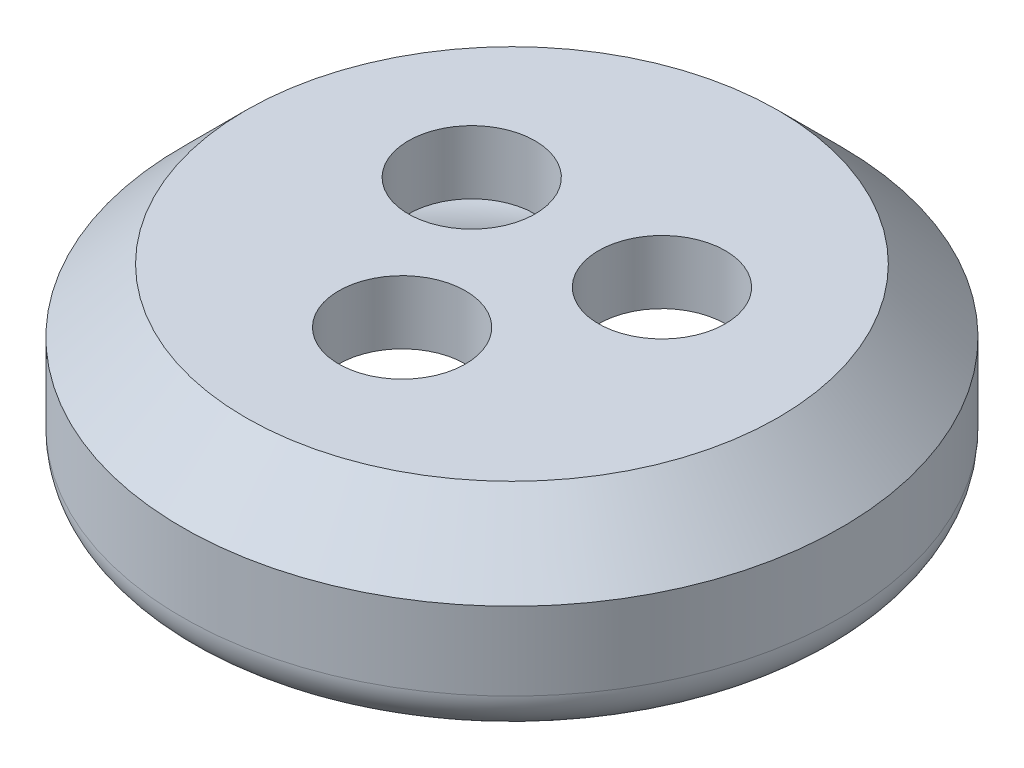
ISO-10303-21;
HEADER;
FILE_DESCRIPTION(('STEP AP214'),'2;1');
FILE_NAME('part.step','',(''),(''),'','','');
FILE_SCHEMA(('AUTOMOTIVE_DESIGN { 1 0 10303 214 1 1 1 1 }'));
ENDSEC;
DATA;
#1=APPLICATION_CONTEXT('core data for automotive mechanical design processes');
#2=APPLICATION_PROTOCOL_DEFINITION('international standard','automotive_design',2000,#1);
#3=PRODUCT_CONTEXT('',#1,'mechanical');
#4=PRODUCT('Part','Part','',(#3));
#5=PRODUCT_RELATED_PRODUCT_CATEGORY('part','',(#4));
#6=PRODUCT_DEFINITION_FORMATION('','',#4);
#7=PRODUCT_DEFINITION_CONTEXT('part definition',#1,'design');
#8=PRODUCT_DEFINITION('design','',#6,#7);
#9=PRODUCT_DEFINITION_SHAPE('','',#8);
#10=(LENGTH_UNIT() NAMED_UNIT(*) SI_UNIT(.MILLI.,.METRE.));
#11=(NAMED_UNIT(*) PLANE_ANGLE_UNIT() SI_UNIT($,.RADIAN.));
#12=(NAMED_UNIT(*) SI_UNIT($,.STERADIAN.) SOLID_ANGLE_UNIT());
#13=UNCERTAINTY_MEASURE_WITH_UNIT(LENGTH_MEASURE(1.E-05),#10,'distance_accuracy_value','');
#14=(GEOMETRIC_REPRESENTATION_CONTEXT(3) GLOBAL_UNCERTAINTY_ASSIGNED_CONTEXT((#13)) GLOBAL_UNIT_ASSIGNED_CONTEXT((#10,
#11,#12)) REPRESENTATION_CONTEXT('',''));
#15=CARTESIAN_POINT('',(0.,0.,0.));
#16=DIRECTION('',(0.,0.,1.));
#17=DIRECTION('',(1.,0.,0.));
#18=AXIS2_PLACEMENT_3D('',#15,#16,#17);
#19=CARTESIAN_POINT('',(0.,22.1772541756381,0.));
#20=DIRECTION('',(0.,-1.,0.));
#21=DIRECTION('',(0.,0.,-1.));
#22=AXIS2_PLACEMENT_3D('',#19,#20,#21);
#23=PLANE('',#22);
#24=CARTESIAN_POINT('',(0.,22.1772541756381,5.19615242270663));
#25=DIRECTION('',(0.,-1.,0.));
#26=DIRECTION('',(0.,0.,-1.));
#27=AXIS2_PLACEMENT_3D('',#24,#25,#26);
#28=CIRCLE('',#27,3.);
#29=CARTESIAN_POINT('',(0.,22.1772541756381,2.19615242270663));
#30=VERTEX_POINT('',#29);
#31=EDGE_CURVE('E103',#30,#30,#28,.F.);
#32=ORIENTED_EDGE('',*,*,#31,.F.);
#33=EDGE_LOOP('',(#32));
#34=FACE_BOUND('',#33,.T.);
#35=CARTESIAN_POINT('',(4.5,22.1772541756381,-2.59807621135331));
#36=DIRECTION('',(0.,-1.,0.));
#37=DIRECTION('',(0.,0.,-1.));
#38=AXIS2_PLACEMENT_3D('',#35,#36,#37);
#39=CIRCLE('',#38,3.);
#40=CARTESIAN_POINT('',(4.5,22.1772541756381,-5.59807621135332));
#41=VERTEX_POINT('',#40);
#42=EDGE_CURVE('E102',#41,#41,#39,.F.);
#43=ORIENTED_EDGE('',*,*,#42,.F.);
#44=EDGE_LOOP('',(#43));
#45=FACE_BOUND('',#44,.T.);
#46=CARTESIAN_POINT('',(-4.5,22.1772541756381,-2.59807621135332));
#47=DIRECTION('',(0.,-1.,0.));
#48=DIRECTION('',(0.,0.,-1.));
#49=AXIS2_PLACEMENT_3D('',#46,#47,#48);
#50=CIRCLE('',#49,3.);
#51=CARTESIAN_POINT('',(-4.5,22.1772541756381,-5.59807621135332));
#52=VERTEX_POINT('',#51);
#53=EDGE_CURVE('E94',#52,#52,#50,.F.);
#54=ORIENTED_EDGE('',*,*,#53,.F.);
#55=EDGE_LOOP('',(#54));
#56=FACE_BOUND('',#55,.T.);
#57=CARTESIAN_POINT('',(0.,22.1772541756381,0.));
#58=DIRECTION('',(0.,-1.,0.));
#59=DIRECTION('',(0.,0.,-1.));
#60=AXIS2_PLACEMENT_3D('',#57,#58,#59);
#61=CIRCLE('',#60,12.5931141475019);
#62=CARTESIAN_POINT('',(0.,22.1772541756381,-12.5931141475019));
#63=VERTEX_POINT('',#62);
#64=EDGE_CURVE('E10',#63,#63,#61,.T.);
#65=ORIENTED_EDGE('',*,*,#64,.F.);
#66=EDGE_LOOP('',(#65));
#67=FACE_BOUND('',#66,.T.);
#68=ADVANCED_FACE('F39',(#34,#45,#56,#67),#23,.F.);
#69=CARTESIAN_POINT('',(0.,22.1772541756381,0.));
#70=DIRECTION('',(0.,-1.,0.));
#71=DIRECTION('',(0.,0.,-1.));
#72=AXIS2_PLACEMENT_3D('',#69,#70,#71);
#73=CONICAL_SURFACE('',#72,12.5931141475019,0.785398163397448);
#74=CARTESIAN_POINT('',(0.,19.1772541756381,0.));
#75=DIRECTION('',(0.,-1.,0.));
#76=DIRECTION('',(0.,0.,-1.));
#77=AXIS2_PLACEMENT_3D('',#74,#75,#76);
#78=CIRCLE('',#77,15.5931141475019);
#79=CARTESIAN_POINT('',(0.,19.1772541756381,-15.5931141475019));
#80=VERTEX_POINT('',#79);
#81=EDGE_CURVE('E46',#80,#80,#78,.T.);
#82=ORIENTED_EDGE('',*,*,#81,.F.);
#83=EDGE_LOOP('',(#82));
#84=FACE_BOUND('',#83,.T.);
#85=ORIENTED_EDGE('',*,*,#64,.T.);
#86=EDGE_LOOP('',(#85));
#87=FACE_BOUND('',#86,.T.);
#88=ADVANCED_FACE('F188',(#84,#87),#73,.T.);
#89=CARTESIAN_POINT('',(0.,0.,0.));
#90=DIRECTION('',(0.,-1.,0.));
#91=DIRECTION('',(0.,0.,-1.));
#92=AXIS2_PLACEMENT_3D('',#89,#90,#91);
#93=CYLINDRICAL_SURFACE('',#92,15.5931141475019);
#94=CARTESIAN_POINT('',(0.,15.4951117662924,0.));
#95=DIRECTION('',(0.,-1.,0.));
#96=DIRECTION('',(0.,0.,-1.));
#97=AXIS2_PLACEMENT_3D('',#94,#95,#96);
#98=CIRCLE('',#97,15.5931141475019);
#99=CARTESIAN_POINT('',(0.,15.4951117662924,-15.5931141475019));
#100=VERTEX_POINT('',#99);
#101=EDGE_CURVE('E51',#100,#100,#98,.T.);
#102=ORIENTED_EDGE('',*,*,#101,.F.);
#103=EDGE_LOOP('',(#102));
#104=FACE_BOUND('',#103,.T.);
#105=ORIENTED_EDGE('',*,*,#81,.T.);
#106=EDGE_LOOP('',(#105));
#107=FACE_BOUND('',#106,.T.);
#108=ADVANCED_FACE('F183',(#104,#107),#93,.T.);
#109=CARTESIAN_POINT('',(0.,15.4951117662924,0.));
#110=DIRECTION('',(0.,-1.,0.));
#111=DIRECTION('',(0.,0.,-1.));
#112=AXIS2_PLACEMENT_3D('',#109,#110,#111);
#113=TOROIDAL_SURFACE('',#112,13.5931141475019,2.);
#114=CARTESIAN_POINT('',(0.,13.4951117662924,0.));
#115=DIRECTION('',(0.,-1.,0.));
#116=DIRECTION('',(0.,0.,-1.));
#117=AXIS2_PLACEMENT_3D('',#114,#115,#116);
#118=CIRCLE('',#117,13.5931141475018);
#119=CARTESIAN_POINT('',(0.,13.4951117662924,-13.5931141475018));
#120=VERTEX_POINT('',#119);
#121=EDGE_CURVE('E56',#120,#120,#118,.T.);
#122=ORIENTED_EDGE('',*,*,#121,.F.);
#123=EDGE_LOOP('',(#122));
#124=FACE_BOUND('',#123,.T.);
#125=ORIENTED_EDGE('',*,*,#101,.T.);
#126=EDGE_LOOP('',(#125));
#127=FACE_BOUND('',#126,.T.);
#128=ADVANCED_FACE('F177',(#124,#127),#113,.T.);
#129=CARTESIAN_POINT('',(-12.5653280214104,13.4951117662924,0.));
#130=DIRECTION('',(0.,1.,0.));
#131=DIRECTION('',(0.,0.,1.));
#132=AXIS2_PLACEMENT_3D('',#129,#130,#131);
#133=PLANE('',#132);
#134=CARTESIAN_POINT('',(0.,13.4951117662924,0.));
#135=DIRECTION('',(0.,-1.,0.));
#136=DIRECTION('',(0.,0.,-1.));
#137=AXIS2_PLACEMENT_3D('',#134,#135,#136);
#138=CIRCLE('',#137,12.5653280214104);
#139=CARTESIAN_POINT('',(0.,13.4951117662924,-12.5653280214104));
#140=VERTEX_POINT('',#139);
#141=EDGE_CURVE('E62',#140,#140,#138,.T.);
#142=ORIENTED_EDGE('',*,*,#141,.F.);
#143=EDGE_LOOP('',(#142));
#144=FACE_BOUND('',#143,.T.);
#145=ORIENTED_EDGE('',*,*,#121,.T.);
#146=EDGE_LOOP('',(#145));
#147=FACE_BOUND('',#146,.T.);
#148=ADVANCED_FACE('F171',(#144,#147),#133,.F.);
#149=CARTESIAN_POINT('',(0.,14.0272541756381,0.));
#150=DIRECTION('',(0.,-1.,0.));
#151=DIRECTION('',(0.,0.,-1.));
#152=AXIS2_PLACEMENT_3D('',#149,#150,#151);
#153=TOROIDAL_SURFACE('',#152,14.7,2.19999999999999);
#154=CARTESIAN_POINT('',(0.,15.8147541756381,0.));
#155=DIRECTION('',(0.,-1.,0.));
#156=DIRECTION('',(0.,0.,-1.));
#157=AXIS2_PLACEMENT_3D('',#154,#155,#156);
#158=CIRCLE('',#157,13.4174853802003);
#159=CARTESIAN_POINT('',(0.,15.8147541756381,-13.4174853802003));
#160=VERTEX_POINT('',#159);
#161=EDGE_CURVE('E66',#160,#160,#158,.T.);
#162=ORIENTED_EDGE('',*,*,#161,.F.);
#163=EDGE_LOOP('',(#162));
#164=FACE_BOUND('',#163,.T.);
#165=ORIENTED_EDGE('',*,*,#141,.T.);
#166=EDGE_LOOP('',(#165));
#167=FACE_BOUND('',#166,.T.);
#168=ADVANCED_FACE('F165',(#164,#167),#153,.T.);
#169=CARTESIAN_POINT('',(0.,16.3835041756381,0.));
#170=DIRECTION('',(0.,-1.,0.));
#171=DIRECTION('',(0.,0.,-1.));
#172=AXIS2_PLACEMENT_3D('',#169,#170,#171);
#173=TOROIDAL_SURFACE('',#172,13.0094125466276,0.700000000000009);
#174=CARTESIAN_POINT('',(0.,15.9971203753347,0.));
#175=DIRECTION('',(0.,-1.,0.));
#176=DIRECTION('',(0.,0.,-1.));
#177=AXIS2_PLACEMENT_3D('',#174,#175,#176);
#178=CIRCLE('',#177,13.5931141475019);
#179=CARTESIAN_POINT('',(0.,15.9971203753347,-13.5931141475019));
#180=VERTEX_POINT('',#179);
#181=EDGE_CURVE('E70',#180,#180,#178,.T.);
#182=ORIENTED_EDGE('',*,*,#181,.F.);
#183=EDGE_LOOP('',(#182));
#184=FACE_BOUND('',#183,.T.);
#185=ORIENTED_EDGE('',*,*,#161,.T.);
#186=EDGE_LOOP('',(#185));
#187=FACE_BOUND('',#186,.T.);
#188=ADVANCED_FACE('F159',(#184,#187),#173,.F.);
#189=CARTESIAN_POINT('',(0.,16.4772541756381,0.));
#190=DIRECTION('',(0.,-1.,0.));
#191=DIRECTION('',(0.,0.,-1.));
#192=AXIS2_PLACEMENT_3D('',#189,#190,#191);
#193=TOROIDAL_SURFACE('',#192,9.42064826581916,4.19999999999999);
#194=CARTESIAN_POINT('',(0.,18.8063097842711,0.));
#195=DIRECTION('',(0.,-1.,0.));
#196=DIRECTION('',(0.,0.,-1.));
#197=AXIS2_PLACEMENT_3D('',#194,#195,#196);
#198=CIRCLE('',#197,12.9157162153582);
#199=CARTESIAN_POINT('',(0.,18.8063097842711,-12.9157162153582));
#200=VERTEX_POINT('',#199);
#201=EDGE_CURVE('E74',#200,#200,#198,.T.);
#202=ORIENTED_EDGE('',*,*,#201,.F.);
#203=EDGE_LOOP('',(#202));
#204=FACE_BOUND('',#203,.T.);
#205=ORIENTED_EDGE('',*,*,#181,.T.);
#206=EDGE_LOOP('',(#205));
#207=FACE_BOUND('',#206,.T.);
#208=ADVANCED_FACE('F153',(#204,#207),#193,.F.);
#209=CARTESIAN_POINT('',(0.,17.5772541756381,0.));
#210=DIRECTION('',(0.,-1.,0.));
#211=DIRECTION('',(0.,0.,-1.));
#212=AXIS2_PLACEMENT_3D('',#209,#210,#211);
#213=TOROIDAL_SURFACE('',#212,10.6245544334476,2.6);
#214=CARTESIAN_POINT('',(0.,20.1772541756381,0.));
#215=DIRECTION('',(0.,-1.,0.));
#216=DIRECTION('',(0.,0.,-1.));
#217=AXIS2_PLACEMENT_3D('',#214,#215,#216);
#218=CIRCLE('',#217,10.6245544334476);
#219=CARTESIAN_POINT('',(0.,20.1772541756381,-10.6245544334476));
#220=VERTEX_POINT('',#219);
#221=EDGE_CURVE('E78',#220,#220,#218,.T.);
#222=ORIENTED_EDGE('',*,*,#221,.F.);
#223=EDGE_LOOP('',(#222));
#224=FACE_BOUND('',#223,.T.);
#225=ORIENTED_EDGE('',*,*,#201,.T.);
#226=EDGE_LOOP('',(#225));
#227=FACE_BOUND('',#226,.T.);
#228=ADVANCED_FACE('F147',(#224,#227),#213,.F.);
#229=CARTESIAN_POINT('',(-9.74999999999999,20.1772541756381,0.));
#230=DIRECTION('',(0.,1.,0.));
#231=DIRECTION('',(0.,0.,1.));
#232=AXIS2_PLACEMENT_3D('',#229,#230,#231);
#233=PLANE('',#232);
#234=CARTESIAN_POINT('',(0.,20.1772541756381,0.));
#235=DIRECTION('',(0.,-1.,0.));
#236=DIRECTION('',(0.,0.,-1.));
#237=AXIS2_PLACEMENT_3D('',#234,#235,#236);
#238=CIRCLE('',#237,9.74999999999999);
#239=CARTESIAN_POINT('',(0.,20.1772541756381,-9.74999999999999));
#240=VERTEX_POINT('',#239);
#241=EDGE_CURVE('E82',#240,#240,#238,.T.);
#242=ORIENTED_EDGE('',*,*,#241,.F.);
#243=EDGE_LOOP('',(#242));
#244=FACE_BOUND('',#243,.T.);
#245=ORIENTED_EDGE('',*,*,#221,.T.);
#246=EDGE_LOOP('',(#245));
#247=FACE_BOUND('',#246,.T.);
#248=ADVANCED_FACE('F141',(#244,#247),#233,.F.);
#249=CARTESIAN_POINT('',(0.,19.4772541756381,0.));
#250=DIRECTION('',(0.,-1.,0.));
#251=DIRECTION('',(0.,0.,-1.));
#252=AXIS2_PLACEMENT_3D('',#249,#250,#251);
#253=TOROIDAL_SURFACE('',#252,9.74999999999999,0.7);
#254=CARTESIAN_POINT('',(0.,19.4772541756381,0.));
#255=DIRECTION('',(0.,-1.,0.));
#256=DIRECTION('',(0.,0.,-1.));
#257=AXIS2_PLACEMENT_3D('',#254,#255,#256);
#258=CIRCLE('',#257,9.05);
#259=CARTESIAN_POINT('',(0.,19.4772541756381,-9.05));
#260=VERTEX_POINT('',#259);
#261=EDGE_CURVE('E86',#260,#260,#258,.T.);
#262=ORIENTED_EDGE('',*,*,#261,.F.);
#263=EDGE_LOOP('',(#262));
#264=FACE_BOUND('',#263,.T.);
#265=ORIENTED_EDGE('',*,*,#241,.T.);
#266=EDGE_LOOP('',(#265));
#267=FACE_BOUND('',#266,.T.);
#268=ADVANCED_FACE('F135',(#264,#267),#253,.F.);
#269=CARTESIAN_POINT('',(0.,0.,0.));
#270=DIRECTION('',(0.,-1.,0.));
#271=DIRECTION('',(0.,0.,-1.));
#272=AXIS2_PLACEMENT_3D('',#269,#270,#271);
#273=CYLINDRICAL_SURFACE('',#272,9.05);
#274=CARTESIAN_POINT('',(0.,19.1772541756381,0.));
#275=DIRECTION('',(0.,-1.,0.));
#276=DIRECTION('',(0.,0.,-1.));
#277=AXIS2_PLACEMENT_3D('',#274,#275,#276);
#278=CIRCLE('',#277,9.04999999999999);
#279=CARTESIAN_POINT('',(0.,19.1772541756381,-9.04999999999999));
#280=VERTEX_POINT('',#279);
#281=EDGE_CURVE('E90',#280,#280,#278,.T.);
#282=ORIENTED_EDGE('',*,*,#281,.F.);
#283=EDGE_LOOP('',(#282));
#284=FACE_BOUND('',#283,.T.);
#285=ORIENTED_EDGE('',*,*,#261,.T.);
#286=EDGE_LOOP('',(#285));
#287=FACE_BOUND('',#286,.T.);
#288=ADVANCED_FACE('F126',(#284,#287),#273,.T.);
#289=CARTESIAN_POINT('',(-9.04999999999999,19.1772541756381,0.));
#290=DIRECTION('',(0.,1.,0.));
#291=DIRECTION('',(0.,0.,1.));
#292=AXIS2_PLACEMENT_3D('',#289,#290,#291);
#293=PLANE('',#292);
#294=CARTESIAN_POINT('',(0.,19.1772541756381,5.19615242270663));
#295=DIRECTION('',(0.,-1.,0.));
#296=DIRECTION('',(0.,0.,-1.));
#297=AXIS2_PLACEMENT_3D('',#294,#295,#296);
#298=CIRCLE('',#297,3.);
#299=CARTESIAN_POINT('',(0.,19.1772541756381,2.19615242270663));
#300=VERTEX_POINT('',#299);
#301=EDGE_CURVE('E108',#300,#300,#298,.T.);
#302=ORIENTED_EDGE('',*,*,#301,.F.);
#303=EDGE_LOOP('',(#302));
#304=FACE_BOUND('',#303,.T.);
#305=CARTESIAN_POINT('',(4.5,19.1772541756381,-2.59807621135331));
#306=DIRECTION('',(0.,-1.,0.));
#307=DIRECTION('',(0.,0.,-1.));
#308=AXIS2_PLACEMENT_3D('',#305,#306,#307);
#309=CIRCLE('',#308,3.);
#310=CARTESIAN_POINT('',(4.5,19.1772541756381,-5.59807621135332));
#311=VERTEX_POINT('',#310);
#312=EDGE_CURVE('E107',#311,#311,#309,.T.);
#313=ORIENTED_EDGE('',*,*,#312,.F.);
#314=EDGE_LOOP('',(#313));
#315=FACE_BOUND('',#314,.T.);
#316=CARTESIAN_POINT('',(-4.5,19.1772541756381,-2.59807621135332));
#317=DIRECTION('',(0.,-1.,0.));
#318=DIRECTION('',(0.,0.,-1.));
#319=AXIS2_PLACEMENT_3D('',#316,#317,#318);
#320=CIRCLE('',#319,3.);
#321=CARTESIAN_POINT('',(-4.5,19.1772541756381,-5.59807621135332));
#322=VERTEX_POINT('',#321);
#323=EDGE_CURVE('E98',#322,#322,#320,.T.);
#324=ORIENTED_EDGE('',*,*,#323,.F.);
#325=EDGE_LOOP('',(#324));
#326=FACE_BOUND('',#325,.T.);
#327=ORIENTED_EDGE('',*,*,#281,.T.);
#328=EDGE_LOOP('',(#327));
#329=FACE_BOUND('',#328,.T.);
#330=ADVANCED_FACE('F122',(#304,#315,#326,#329),#293,.F.);
#331=CARTESIAN_POINT('',(-4.5,22.1782541756381,-2.59807621135332));
#332=DIRECTION('',(0.,-1.,0.));
#333=DIRECTION('',(0.,0.,-1.));
#334=AXIS2_PLACEMENT_3D('',#331,#332,#333);
#335=CYLINDRICAL_SURFACE('',#334,3.);
#336=ORIENTED_EDGE('',*,*,#323,.T.);
#337=EDGE_LOOP('',(#336));
#338=FACE_BOUND('',#337,.T.);
#339=ORIENTED_EDGE('',*,*,#53,.T.);
#340=EDGE_LOOP('',(#339));
#341=FACE_BOUND('',#340,.T.);
#342=ADVANCED_FACE('F125',(#338,#341),#335,.F.);
#343=CARTESIAN_POINT('',(4.5,22.1782541756381,-2.59807621135331));
#344=DIRECTION('',(0.,-1.,0.));
#345=DIRECTION('',(0.,0.,-1.));
#346=AXIS2_PLACEMENT_3D('',#343,#344,#345);
#347=CYLINDRICAL_SURFACE('',#346,3.);
#348=ORIENTED_EDGE('',*,*,#312,.T.);
#349=EDGE_LOOP('',(#348));
#350=FACE_BOUND('',#349,.T.);
#351=ORIENTED_EDGE('',*,*,#42,.T.);
#352=EDGE_LOOP('',(#351));
#353=FACE_BOUND('',#352,.T.);
#354=ADVANCED_FACE('F119',(#350,#353),#347,.F.);
#355=CARTESIAN_POINT('',(0.,22.1782541756381,5.19615242270663));
#356=DIRECTION('',(0.,-1.,0.));
#357=DIRECTION('',(0.,0.,-1.));
#358=AXIS2_PLACEMENT_3D('',#355,#356,#357);
#359=CYLINDRICAL_SURFACE('',#358,3.);
#360=ORIENTED_EDGE('',*,*,#301,.T.);
#361=EDGE_LOOP('',(#360));
#362=FACE_BOUND('',#361,.T.);
#363=ORIENTED_EDGE('',*,*,#31,.T.);
#364=EDGE_LOOP('',(#363));
#365=FACE_BOUND('',#364,.T.);
#366=ADVANCED_FACE('F211',(#362,#365),#359,.F.);
#367=CLOSED_SHELL('',(#68,#88,#108,#128,#148,#168,#188,#208,#228,#248,#268,#288,#330,#342,#354,#366));
#368=MANIFOLD_SOLID_BREP('B2',#367);
#369=ADVANCED_BREP_SHAPE_REPRESENTATION('',(#18,#368),#14);
#370=SHAPE_DEFINITION_REPRESENTATION(#9,#369);
ENDSEC;
END-ISO-10303-21;
